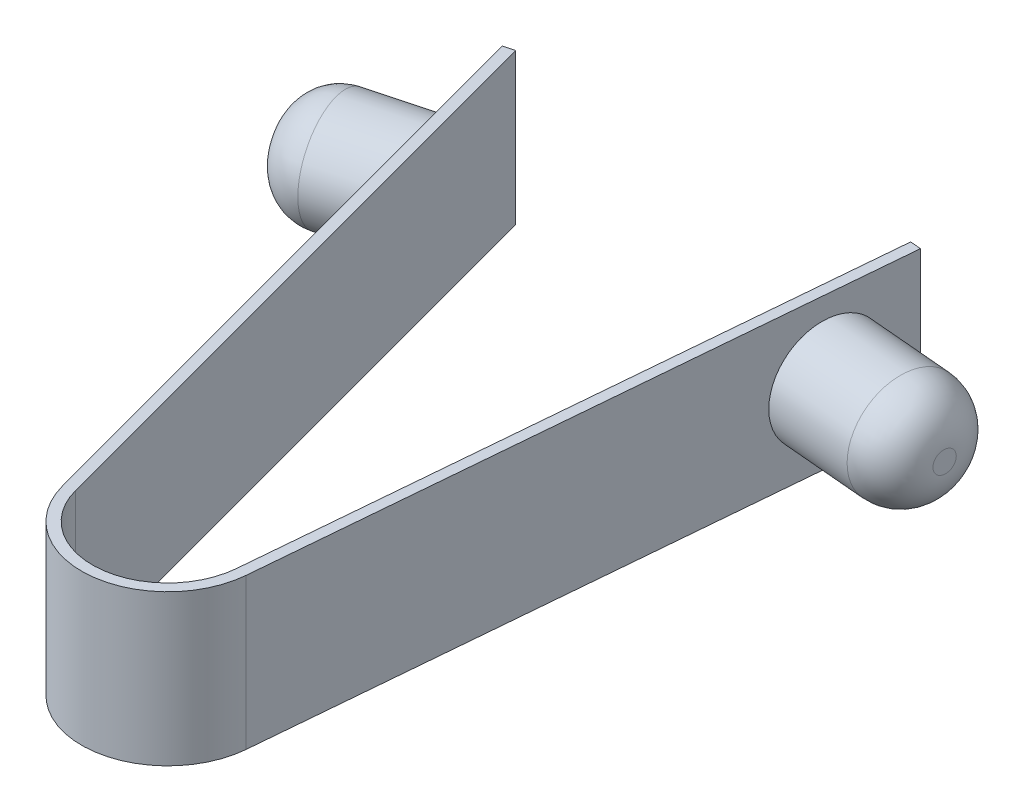
ISO-10303-21;
HEADER;
FILE_DESCRIPTION(('STEP AP214'),'2;1');
FILE_NAME('part.step','',(''),(''),'','','');
FILE_SCHEMA(('AUTOMOTIVE_DESIGN { 1 0 10303 214 1 1 1 1 }'));
ENDSEC;
DATA;
#1=APPLICATION_CONTEXT('core data for automotive mechanical design processes');
#2=APPLICATION_PROTOCOL_DEFINITION('international standard','automotive_design',2000,#1);
#3=PRODUCT_CONTEXT('',#1,'mechanical');
#4=PRODUCT('Part','Part','',(#3));
#5=PRODUCT_RELATED_PRODUCT_CATEGORY('part','',(#4));
#6=PRODUCT_DEFINITION_FORMATION('','',#4);
#7=PRODUCT_DEFINITION_CONTEXT('part definition',#1,'design');
#8=PRODUCT_DEFINITION('design','',#6,#7);
#9=PRODUCT_DEFINITION_SHAPE('','',#8);
#10=(LENGTH_UNIT() NAMED_UNIT(*) SI_UNIT(.MILLI.,.METRE.));
#11=(NAMED_UNIT(*) PLANE_ANGLE_UNIT() SI_UNIT($,.RADIAN.));
#12=(NAMED_UNIT(*) SI_UNIT($,.STERADIAN.) SOLID_ANGLE_UNIT());
#13=UNCERTAINTY_MEASURE_WITH_UNIT(LENGTH_MEASURE(1.E-05),#10,'distance_accuracy_value','');
#14=(GEOMETRIC_REPRESENTATION_CONTEXT(3) GLOBAL_UNCERTAINTY_ASSIGNED_CONTEXT((#13)) GLOBAL_UNIT_ASSIGNED_CONTEXT((#10,
#11,#12)) REPRESENTATION_CONTEXT('',''));
#15=CARTESIAN_POINT('',(0.,0.,0.));
#16=DIRECTION('',(0.,0.,1.));
#17=DIRECTION('',(1.,0.,0.));
#18=AXIS2_PLACEMENT_3D('',#15,#16,#17);
#19=CARTESIAN_POINT('',(0.,11.1125,0.));
#20=DIRECTION('',(0.,-1.,0.));
#21=DIRECTION('',(0.,0.,-1.));
#22=AXIS2_PLACEMENT_3D('',#19,#20,#21);
#23=CYLINDRICAL_SURFACE('',#22,6.35);
#24=CARTESIAN_POINT('',(0.,0.,0.));
#25=DIRECTION('',(0.,1.,0.));
#26=DIRECTION('',(0.,0.,1.));
#27=AXIS2_PLACEMENT_3D('',#24,#25,#26);
#28=CIRCLE('',#27,6.35);
#29=CARTESIAN_POINT('',(-6.13362899693558,0.,1.64350093640101));
#30=VERTEX_POINT('',#29);
#31=CARTESIAN_POINT('',(6.32583633288258,0.,0.553438966447629));
#32=VERTEX_POINT('',#31);
#33=EDGE_CURVE('E130',#30,#32,#28,.T.);
#34=ORIENTED_EDGE('',*,*,#33,.T.);
#35=DIRECTION('',(0.,-1.,0.));
#36=VECTOR('',#35,1.);
#37=CARTESIAN_POINT('',(6.32583633288258,11.1125,0.553438966447629));
#38=LINE('',#37,#36);
#39=CARTESIAN_POINT('',(6.32583633288258,11.1125,0.553438966447629));
#40=VERTEX_POINT('',#39);
#41=EDGE_CURVE('E161',#40,#32,#38,.T.);
#42=ORIENTED_EDGE('',*,*,#41,.F.);
#43=CARTESIAN_POINT('',(0.,11.1125,0.));
#44=DIRECTION('',(0.,1.,0.));
#45=DIRECTION('',(0.,0.,1.));
#46=AXIS2_PLACEMENT_3D('',#43,#44,#45);
#47=CIRCLE('',#46,6.35);
#48=CARTESIAN_POINT('',(-6.13362899693558,11.1125,1.64350093640101));
#49=VERTEX_POINT('',#48);
#50=EDGE_CURVE('E151',#49,#40,#47,.T.);
#51=ORIENTED_EDGE('',*,*,#50,.F.);
#52=DIRECTION('',(0.,-1.,0.));
#53=VECTOR('',#52,1.);
#54=CARTESIAN_POINT('',(-6.13362899693558,11.1125,1.64350093640101));
#55=LINE('',#54,#53);
#56=EDGE_CURVE('E49',#49,#30,#55,.T.);
#57=ORIENTED_EDGE('',*,*,#56,.T.);
#58=EDGE_LOOP('',(#34,#42,#51,#57));
#59=FACE_BOUND('',#58,.T.);
#60=ADVANCED_FACE('F32',(#59),#23,.T.);
#61=CARTESIAN_POINT('',(6.32583633288258,11.1125,0.553438966447629));
#62=DIRECTION('',(-0.996194698091746,0.,-0.0871557427476579));
#63=DIRECTION('',(-0.0871557427476579,0.,0.996194698091746));
#64=AXIS2_PLACEMENT_3D('',#61,#62,#63);
#65=PLANE('',#64);
#66=CARTESIAN_POINT('',(9.77027588248144,5.55625,-38.8166852391671));
#67=DIRECTION('',(-0.996194698091746,0.,-0.0871557427476579));
#68=DIRECTION('',(-0.0871557427476579,0.,0.996194698091746));
#69=AXIS2_PLACEMENT_3D('',#66,#67,#68);
#70=CIRCLE('',#69,3.96875);
#71=CARTESIAN_POINT('',(9.42437652845167,5.55625,-34.8630375311155));
#72=VERTEX_POINT('',#71);
#73=EDGE_CURVE('E163',#72,#72,#70,.F.);
#74=ORIENTED_EDGE('',*,*,#73,.F.);
#75=EDGE_LOOP('',(#74));
#76=FACE_BOUND('',#75,.T.);
#77=DIRECTION('',(0.0871557427476579,0.,-0.996194698091746));
#78=VECTOR('',#77,1.);
#79=CARTESIAN_POINT('',(6.32583633288258,0.,0.553438966447629));
#80=LINE('',#79,#78);
#81=CARTESIAN_POINT('',(10.3237148489291,0.,-45.1425215720497));
#82=VERTEX_POINT('',#81);
#83=EDGE_CURVE('E132',#32,#82,#80,.T.);
#84=ORIENTED_EDGE('',*,*,#83,.T.);
#85=DIRECTION('',(0.,-1.,0.));
#86=VECTOR('',#85,1.);
#87=CARTESIAN_POINT('',(10.3237148489291,11.1125,-45.1425215720497));
#88=LINE('',#87,#86);
#89=CARTESIAN_POINT('',(10.3237148489291,11.1125,-45.1425215720497));
#90=VERTEX_POINT('',#89);
#91=EDGE_CURVE('E159',#90,#82,#88,.T.);
#92=ORIENTED_EDGE('',*,*,#91,.F.);
#93=DIRECTION('',(0.0871557427476579,0.,-0.996194698091746));
#94=VECTOR('',#93,1.);
#95=CARTESIAN_POINT('',(6.32583633288258,11.1125,0.553438966447629));
#96=LINE('',#95,#94);
#97=EDGE_CURVE('E88',#40,#90,#96,.T.);
#98=ORIENTED_EDGE('',*,*,#97,.F.);
#99=ORIENTED_EDGE('',*,*,#41,.T.);
#100=EDGE_LOOP('',(#84,#92,#98,#99));
#101=FACE_BOUND('',#100,.T.);
#102=ADVANCED_FACE('F185',(#76,#101),#65,.F.);
#103=CARTESIAN_POINT('',(9.53298530731874,11.1125,-45.2117014428556));
#104=DIRECTION('',(0.0871557427476545,0.,-0.996194698091746));
#105=DIRECTION('',(-0.996194698091746,0.,-0.0871557427476545));
#106=AXIS2_PLACEMENT_3D('',#103,#104,#105);
#107=PLANE('',#106);
#108=DIRECTION('',(0.996194698091746,0.,0.0871557427476545));
#109=VECTOR('',#108,1.);
#110=CARTESIAN_POINT('',(9.53298530731874,0.,-45.2117014428556));
#111=LINE('',#110,#109);
#112=CARTESIAN_POINT('',(9.53298530731874,0.,-45.2117014428556));
#113=VERTEX_POINT('',#112);
#114=EDGE_CURVE('E136',#113,#82,#111,.T.);
#115=ORIENTED_EDGE('',*,*,#114,.F.);
#116=DIRECTION('',(0.,-1.,0.));
#117=VECTOR('',#116,1.);
#118=CARTESIAN_POINT('',(9.53298530731874,11.1125,-45.2117014428556));
#119=LINE('',#118,#117);
#120=CARTESIAN_POINT('',(9.53298530731874,11.1125,-45.2117014428556));
#121=VERTEX_POINT('',#120);
#122=EDGE_CURVE('E157',#121,#113,#119,.T.);
#123=ORIENTED_EDGE('',*,*,#122,.F.);
#124=DIRECTION('',(0.996194698091746,0.,0.0871557427476545));
#125=VECTOR('',#124,1.);
#126=CARTESIAN_POINT('',(9.53298530731874,11.1125,-45.2117014428556));
#127=LINE('',#126,#125);
#128=EDGE_CURVE('E331',#121,#90,#127,.T.);
#129=ORIENTED_EDGE('',*,*,#128,.T.);
#130=ORIENTED_EDGE('',*,*,#91,.T.);
#131=EDGE_LOOP('',(#115,#123,#129,#130));
#132=FACE_BOUND('',#131,.T.);
#133=ADVANCED_FACE('F190',(#132),#107,.T.);
#134=CARTESIAN_POINT('',(9.53298530731874,11.1125,-45.2117014428556));
#135=DIRECTION('',(0.996194698091746,0.,0.0871557427476578));
#136=DIRECTION('',(0.0871557427476578,0.,-0.996194698091746));
#137=AXIS2_PLACEMENT_3D('',#134,#135,#136);
#138=PLANE('',#137);
#139=DIRECTION('',(-0.0871557427476578,0.,0.996194698091746));
#140=VECTOR('',#139,1.);
#141=CARTESIAN_POINT('',(9.53298530731874,0.,-45.2117014428556));
#142=LINE('',#141,#140);
#143=CARTESIAN_POINT('',(5.53510679127226,0.,0.484259095641674));
#144=VERTEX_POINT('',#143);
#145=EDGE_CURVE('E139',#113,#144,#142,.T.);
#146=ORIENTED_EDGE('',*,*,#145,.T.);
#147=DIRECTION('',(0.,-1.,0.));
#148=VECTOR('',#147,1.);
#149=CARTESIAN_POINT('',(5.53510679127226,11.1125,0.484259095641674));
#150=LINE('',#149,#148);
#151=CARTESIAN_POINT('',(5.53510679127226,11.1125,0.484259095641674));
#152=VERTEX_POINT('',#151);
#153=EDGE_CURVE('E155',#152,#144,#150,.T.);
#154=ORIENTED_EDGE('',*,*,#153,.F.);
#155=DIRECTION('',(-0.0871557427476578,0.,0.996194698091746));
#156=VECTOR('',#155,1.);
#157=CARTESIAN_POINT('',(9.53298530731874,11.1125,-45.2117014428556));
#158=LINE('',#157,#156);
#159=EDGE_CURVE('E334',#121,#152,#158,.T.);
#160=ORIENTED_EDGE('',*,*,#159,.F.);
#161=ORIENTED_EDGE('',*,*,#122,.T.);
#162=EDGE_LOOP('',(#146,#154,#160,#161));
#163=FACE_BOUND('',#162,.T.);
#164=ADVANCED_FACE('F196',(#163),#138,.F.);
#165=CARTESIAN_POINT('',(0.,11.1125,0.));
#166=DIRECTION('',(0.,-1.,0.));
#167=DIRECTION('',(0.,0.,-1.));
#168=AXIS2_PLACEMENT_3D('',#165,#166,#167);
#169=CYLINDRICAL_SURFACE('',#168,5.55625);
#170=CARTESIAN_POINT('',(0.,0.,0.));
#171=DIRECTION('',(0.,1.,0.));
#172=DIRECTION('',(0.,0.,1.));
#173=AXIS2_PLACEMENT_3D('',#170,#171,#172);
#174=CIRCLE('',#173,5.55625);
#175=CARTESIAN_POINT('',(-5.36692537231863,0.,1.43806331935088));
#176=VERTEX_POINT('',#175);
#177=EDGE_CURVE('E142',#176,#144,#174,.T.);
#178=ORIENTED_EDGE('',*,*,#177,.F.);
#179=DIRECTION('',(0.,-1.,0.));
#180=VECTOR('',#179,1.);
#181=CARTESIAN_POINT('',(-5.36692537231863,11.1125,1.43806331935088));
#182=LINE('',#181,#180);
#183=CARTESIAN_POINT('',(-5.36692537231863,11.1125,1.43806331935088));
#184=VERTEX_POINT('',#183);
#185=EDGE_CURVE('E113',#184,#176,#182,.T.);
#186=ORIENTED_EDGE('',*,*,#185,.F.);
#187=CARTESIAN_POINT('',(0.,11.1125,0.));
#188=DIRECTION('',(0.,1.,0.));
#189=DIRECTION('',(0.,0.,1.));
#190=AXIS2_PLACEMENT_3D('',#187,#188,#189);
#191=CIRCLE('',#190,5.55625);
#192=EDGE_CURVE('E122',#184,#152,#191,.T.);
#193=ORIENTED_EDGE('',*,*,#192,.T.);
#194=ORIENTED_EDGE('',*,*,#153,.T.);
#195=EDGE_LOOP('',(#178,#186,#193,#194));
#196=FACE_BOUND('',#195,.T.);
#197=ADVANCED_FACE('F200',(#196),#169,.F.);
#198=CARTESIAN_POINT('',(-17.2390874047722,11.1125,-42.8694485814559));
#199=DIRECTION('',(0.965925826289068,0.,-0.258819045102522));
#200=DIRECTION('',(-0.258819045102522,0.,-0.965925826289068));
#201=AXIS2_PLACEMENT_3D('',#198,#199,#200);
#202=PLANE('',#201);
#203=DIRECTION('',(0.258819045102522,0.,0.965925826289068));
#204=VECTOR('',#203,1.);
#205=CARTESIAN_POINT('',(-17.2390874047722,0.,-42.8694485814559));
#206=LINE('',#205,#204);
#207=CARTESIAN_POINT('',(-17.2390874047722,0.,-42.8694485814559));
#208=VERTEX_POINT('',#207);
#209=EDGE_CURVE('E109',#208,#176,#206,.T.);
#210=ORIENTED_EDGE('',*,*,#209,.F.);
#211=DIRECTION('',(0.,-1.,0.));
#212=VECTOR('',#211,1.);
#213=CARTESIAN_POINT('',(-17.2390874047722,11.1125,-42.8694485814559));
#214=LINE('',#213,#212);
#215=CARTESIAN_POINT('',(-17.2390874047722,11.1125,-42.8694485814559));
#216=VERTEX_POINT('',#215);
#217=EDGE_CURVE('E104',#216,#208,#214,.T.);
#218=ORIENTED_EDGE('',*,*,#217,.F.);
#219=DIRECTION('',(0.258819045102522,0.,0.965925826289068));
#220=VECTOR('',#219,1.);
#221=CARTESIAN_POINT('',(-17.2390874047722,11.1125,-42.8694485814559));
#222=LINE('',#221,#220);
#223=EDGE_CURVE('E107',#216,#184,#222,.T.);
#224=ORIENTED_EDGE('',*,*,#223,.T.);
#225=ORIENTED_EDGE('',*,*,#185,.T.);
#226=EDGE_LOOP('',(#210,#218,#224,#225));
#227=FACE_BOUND('',#226,.T.);
#228=ADVANCED_FACE('F106',(#227),#202,.T.);
#229=CARTESIAN_POINT('',(-18.0057910293892,11.1125,-42.6640109644058));
#230=DIRECTION('',(-0.258819045102523,0.,-0.965925826289068));
#231=DIRECTION('',(-0.965925826289068,0.,0.258819045102523));
#232=AXIS2_PLACEMENT_3D('',#229,#230,#231);
#233=PLANE('',#232);
#234=DIRECTION('',(0.965925826289068,0.,-0.258819045102523));
#235=VECTOR('',#234,1.);
#236=CARTESIAN_POINT('',(-18.0057910293892,0.,-42.6640109644058));
#237=LINE('',#236,#235);
#238=CARTESIAN_POINT('',(-18.0057910293892,0.,-42.6640109644058));
#239=VERTEX_POINT('',#238);
#240=EDGE_CURVE('E146',#239,#208,#237,.T.);
#241=ORIENTED_EDGE('',*,*,#240,.F.);
#242=DIRECTION('',(0.,-1.,0.));
#243=VECTOR('',#242,1.);
#244=CARTESIAN_POINT('',(-18.0057910293892,11.1125,-42.6640109644058));
#245=LINE('',#244,#243);
#246=CARTESIAN_POINT('',(-18.0057910293892,11.1125,-42.6640109644058));
#247=VERTEX_POINT('',#246);
#248=EDGE_CURVE('E75',#247,#239,#245,.T.);
#249=ORIENTED_EDGE('',*,*,#248,.F.);
#250=DIRECTION('',(0.965925826289068,0.,-0.258819045102523));
#251=VECTOR('',#250,1.);
#252=CARTESIAN_POINT('',(-18.0057910293892,11.1125,-42.6640109644058));
#253=LINE('',#252,#251);
#254=EDGE_CURVE('E120',#247,#216,#253,.T.);
#255=ORIENTED_EDGE('',*,*,#254,.T.);
#256=ORIENTED_EDGE('',*,*,#217,.T.);
#257=EDGE_LOOP('',(#241,#249,#255,#256));
#258=FACE_BOUND('',#257,.T.);
#259=ADVANCED_FACE('F124',(#258),#233,.T.);
#260=CARTESIAN_POINT('',(-6.13362899693558,11.1125,1.64350093640101));
#261=DIRECTION('',(-0.965925826289068,0.,0.258819045102522));
#262=DIRECTION('',(0.258819045102522,0.,0.965925826289068));
#263=AXIS2_PLACEMENT_3D('',#260,#261,#262);
#264=PLANE('',#263);
#265=CARTESIAN_POINT('',(-16.3622900929882,5.55625,-36.5303819674702));
#266=DIRECTION('',(-0.965925826289068,0.,0.258819045102522));
#267=DIRECTION('',(0.258819045102522,0.,0.965925826289068));
#268=AXIS2_PLACEMENT_3D('',#265,#266,#267);
#269=CIRCLE('',#268,3.96874999999999);
#270=CARTESIAN_POINT('',(-15.3351020077375,5.55625,-32.6968638443855));
#271=VERTEX_POINT('',#270);
#272=EDGE_CURVE('E133',#271,#271,#269,.T.);
#273=ORIENTED_EDGE('',*,*,#272,.F.);
#274=EDGE_LOOP('',(#273));
#275=FACE_BOUND('',#274,.T.);
#276=DIRECTION('',(-0.258819045102522,0.,-0.965925826289068));
#277=VECTOR('',#276,1.);
#278=CARTESIAN_POINT('',(-6.13362899693558,0.,1.64350093640101));
#279=LINE('',#278,#277);
#280=EDGE_CURVE('E148',#30,#239,#279,.T.);
#281=ORIENTED_EDGE('',*,*,#280,.F.);
#282=ORIENTED_EDGE('',*,*,#56,.F.);
#283=DIRECTION('',(-0.258819045102522,0.,-0.965925826289068));
#284=VECTOR('',#283,1.);
#285=CARTESIAN_POINT('',(-6.13362899693558,11.1125,1.64350093640101));
#286=LINE('',#285,#284);
#287=EDGE_CURVE('E125',#49,#247,#286,.T.);
#288=ORIENTED_EDGE('',*,*,#287,.T.);
#289=ORIENTED_EDGE('',*,*,#248,.T.);
#290=EDGE_LOOP('',(#281,#282,#288,#289));
#291=FACE_BOUND('',#290,.T.);
#292=ADVANCED_FACE('F209',(#275,#291),#264,.T.);
#293=CARTESIAN_POINT('',(0.,11.1125,0.));
#294=DIRECTION('',(0.,1.,0.));
#295=DIRECTION('',(0.,0.,1.));
#296=AXIS2_PLACEMENT_3D('',#293,#294,#295);
#297=PLANE('',#296);
#298=ORIENTED_EDGE('',*,*,#50,.T.);
#299=ORIENTED_EDGE('',*,*,#97,.T.);
#300=ORIENTED_EDGE('',*,*,#128,.F.);
#301=ORIENTED_EDGE('',*,*,#159,.T.);
#302=ORIENTED_EDGE('',*,*,#192,.F.);
#303=ORIENTED_EDGE('',*,*,#223,.F.);
#304=ORIENTED_EDGE('',*,*,#254,.F.);
#305=ORIENTED_EDGE('',*,*,#287,.F.);
#306=EDGE_LOOP('',(#298,#299,#300,#301,#302,#303,#304,#305));
#307=FACE_BOUND('',#306,.T.);
#308=ADVANCED_FACE('F118',(#307),#297,.T.);
#309=CARTESIAN_POINT('',(0.,0.,0.));
#310=DIRECTION('',(0.,1.,0.));
#311=DIRECTION('',(0.,0.,1.));
#312=AXIS2_PLACEMENT_3D('',#309,#310,#311);
#313=PLANE('',#312);
#314=ORIENTED_EDGE('',*,*,#33,.F.);
#315=ORIENTED_EDGE('',*,*,#280,.T.);
#316=ORIENTED_EDGE('',*,*,#240,.T.);
#317=ORIENTED_EDGE('',*,*,#209,.T.);
#318=ORIENTED_EDGE('',*,*,#177,.T.);
#319=ORIENTED_EDGE('',*,*,#145,.F.);
#320=ORIENTED_EDGE('',*,*,#114,.T.);
#321=ORIENTED_EDGE('',*,*,#83,.F.);
#322=EDGE_LOOP('',(#314,#315,#316,#317,#318,#319,#320,#321));
#323=FACE_BOUND('',#322,.T.);
#324=ADVANCED_FACE('F213',(#323),#313,.F.);
#325=CARTESIAN_POINT('',(19.2590303818053,5.55625,-37.9865267894956));
#326=DIRECTION('',(-0.996194698091746,0.,-0.0871557427476579));
#327=DIRECTION('',(-0.0871557427476579,0.,0.996194698091746));
#328=AXIS2_PLACEMENT_3D('',#325,#326,#327);
#329=CYLINDRICAL_SURFACE('',#328,3.96875);
#330=CARTESIAN_POINT('',(16.096112215364,5.55625,-38.2632462727194));
#331=DIRECTION('',(0.996194698091746,0.,0.0871557427476579));
#332=DIRECTION('',(0.0871557427476579,0.,-0.996194698091746));
#333=AXIS2_PLACEMENT_3D('',#330,#331,#332);
#334=CIRCLE('',#333,3.96875);
#335=CARTESIAN_POINT('',(16.4420115693938,5.55625,-42.2168939807711));
#336=VERTEX_POINT('',#335);
#337=EDGE_CURVE('E169',#336,#336,#334,.F.);
#338=ORIENTED_EDGE('',*,*,#337,.T.);
#339=EDGE_LOOP('',(#338));
#340=FACE_BOUND('',#339,.T.);
#341=ORIENTED_EDGE('',*,*,#73,.T.);
#342=EDGE_LOOP('',(#341));
#343=FACE_BOUND('',#342,.T.);
#344=ADVANCED_FACE('F216',(#340,#343),#329,.T.);
#345=CARTESIAN_POINT('',(19.2590303818053,5.55625,-37.9865267894956));
#346=DIRECTION('',(0.996194698091746,0.,0.0871557427476579));
#347=DIRECTION('',(0.0871557427476579,0.,-0.996194698091746));
#348=AXIS2_PLACEMENT_3D('',#345,#346,#347);
#349=PLANE('',#348);
#350=CARTESIAN_POINT('',(19.2590303818053,5.55625,-37.9865267894956));
#351=DIRECTION('',(0.996194698091746,0.,0.0871557427476579));
#352=DIRECTION('',(0.0871557427476579,0.,-0.996194698091746));
#353=AXIS2_PLACEMENT_3D('',#350,#351,#352);
#354=CIRCLE('',#353,0.793749999999996);
#355=CARTESIAN_POINT('',(19.3282102526113,5.55625,-38.777256331106));
#356=VERTEX_POINT('',#355);
#357=EDGE_CURVE('E166',#356,#356,#354,.T.);
#358=ORIENTED_EDGE('',*,*,#357,.T.);
#359=EDGE_LOOP('',(#358));
#360=FACE_BOUND('',#359,.T.);
#361=ADVANCED_FACE('F222',(#360),#349,.T.);
#362=CARTESIAN_POINT('',(-25.5627335883915,5.55625,-34.0651305628687));
#363=DIRECTION('',(0.965925826289068,0.,-0.258819045102522));
#364=DIRECTION('',(-0.258819045102522,0.,-0.965925826289068));
#365=AXIS2_PLACEMENT_3D('',#362,#363,#364);
#366=CYLINDRICAL_SURFACE('',#365,3.96874999999999);
#367=CARTESIAN_POINT('',(-22.4959190899237,5.55625,-34.8868810310692));
#368=DIRECTION('',(-0.965925826289068,0.,0.258819045102522));
#369=DIRECTION('',(0.258819045102522,0.,0.965925826289068));
#370=AXIS2_PLACEMENT_3D('',#367,#368,#369);
#371=CIRCLE('',#370,3.96874999999999);
#372=CARTESIAN_POINT('',(-21.4687310046731,5.55625,-31.0533629079844));
#373=VERTEX_POINT('',#372);
#374=EDGE_CURVE('E11',#373,#373,#371,.F.);
#375=ORIENTED_EDGE('',*,*,#374,.T.);
#376=EDGE_LOOP('',(#375));
#377=FACE_BOUND('',#376,.T.);
#378=ORIENTED_EDGE('',*,*,#272,.T.);
#379=EDGE_LOOP('',(#378));
#380=FACE_BOUND('',#379,.T.);
#381=ADVANCED_FACE('F226',(#377,#380),#366,.T.);
#382=CARTESIAN_POINT('',(-25.5627335883915,5.55625,-34.0651305628687));
#383=DIRECTION('',(-0.965925826289068,0.,0.258819045102522));
#384=DIRECTION('',(0.258819045102522,0.,0.965925826289068));
#385=AXIS2_PLACEMENT_3D('',#382,#383,#384);
#386=PLANE('',#385);
#387=CARTESIAN_POINT('',(-25.5627335883915,5.55625,-34.0651305628687));
#388=DIRECTION('',(-0.965925826289068,0.,0.258819045102522));
#389=DIRECTION('',(0.258819045102522,0.,0.965925826289068));
#390=AXIS2_PLACEMENT_3D('',#387,#388,#389);
#391=CIRCLE('',#390,0.793749999999992);
#392=CARTESIAN_POINT('',(-25.3572959713414,5.55625,-33.2984269382517));
#393=VERTEX_POINT('',#392);
#394=EDGE_CURVE('E41',#393,#393,#391,.T.);
#395=ORIENTED_EDGE('',*,*,#394,.T.);
#396=EDGE_LOOP('',(#395));
#397=FACE_BOUND('',#396,.T.);
#398=ADVANCED_FACE('F174',(#397),#386,.T.);
#399=CARTESIAN_POINT('',(16.096112215364,5.55625,-38.2632462727195));
#400=DIRECTION('',(0.996194698091746,0.,0.0871557427476579));
#401=DIRECTION('',(0.0871557427476579,0.,-0.996194698091746));
#402=AXIS2_PLACEMENT_3D('',#399,#400,#401);
#403=DEGENERATE_TOROIDAL_SURFACE('',#402,0.793749999999996,3.175,.T.);
#404=ORIENTED_EDGE('',*,*,#337,.F.);
#405=EDGE_LOOP('',(#404));
#406=FACE_BOUND('',#405,.T.);
#407=ORIENTED_EDGE('',*,*,#357,.F.);
#408=EDGE_LOOP('',(#407));
#409=FACE_BOUND('',#408,.T.);
#410=ADVANCED_FACE('F177',(#406,#409),#403,.T.);
#411=CARTESIAN_POINT('',(-22.4959190899237,5.55625,-34.8868810310692));
#412=DIRECTION('',(-0.965925826289068,0.,0.258819045102522));
#413=DIRECTION('',(0.258819045102522,0.,0.965925826289068));
#414=AXIS2_PLACEMENT_3D('',#411,#412,#413);
#415=DEGENERATE_TOROIDAL_SURFACE('',#414,0.793749999999992,3.175,.T.);
#416=ORIENTED_EDGE('',*,*,#374,.F.);
#417=EDGE_LOOP('',(#416));
#418=FACE_BOUND('',#417,.T.);
#419=ORIENTED_EDGE('',*,*,#394,.F.);
#420=EDGE_LOOP('',(#419));
#421=FACE_BOUND('',#420,.T.);
#422=ADVANCED_FACE('F34',(#418,#421),#415,.T.);
#423=CLOSED_SHELL('',(#60,#102,#133,#164,#197,#228,#259,#292,#308,#324,#344,#361,#381,#398,#410,#422));
#424=MANIFOLD_SOLID_BREP('B2',#423);
#425=ADVANCED_BREP_SHAPE_REPRESENTATION('',(#18,#424),#14);
#426=SHAPE_DEFINITION_REPRESENTATION(#9,#425);
ENDSEC;
END-ISO-10303-21;
